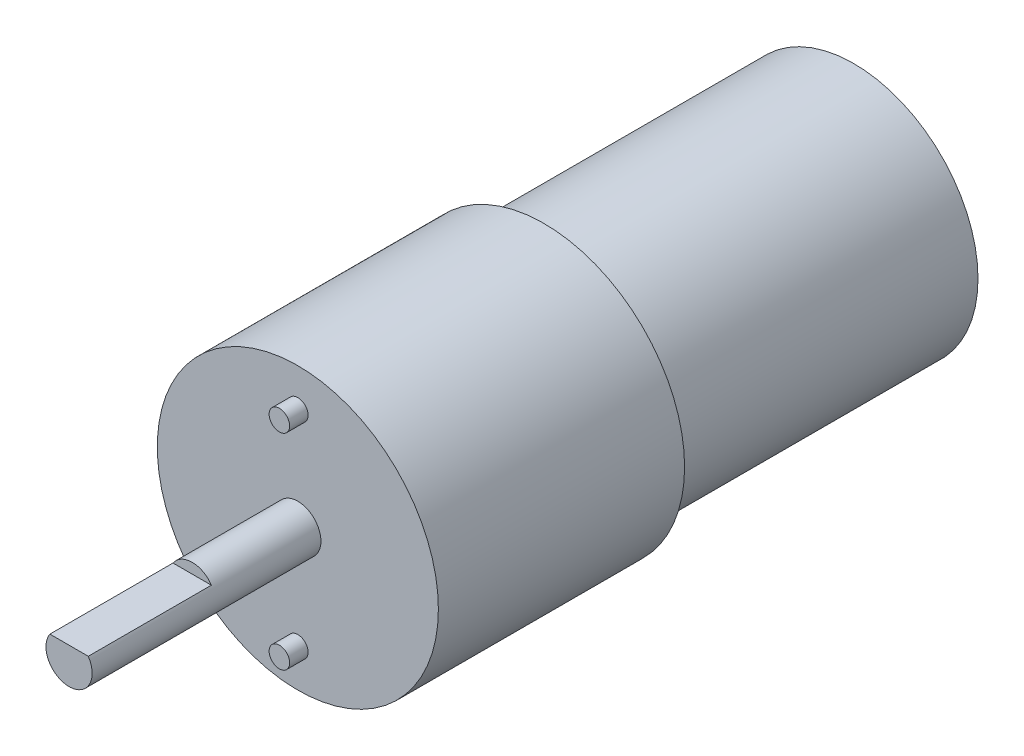
ISO-10303-21;
HEADER;
FILE_DESCRIPTION(('STEP AP214'),'2;1');
FILE_NAME('part.step','',(''),(''),'','','');
FILE_SCHEMA(('AUTOMOTIVE_DESIGN { 1 0 10303 214 1 1 1 1 }'));
ENDSEC;
DATA;
#1=APPLICATION_CONTEXT('core data for automotive mechanical design processes');
#2=APPLICATION_PROTOCOL_DEFINITION('international standard','automotive_design',2000,#1);
#3=PRODUCT_CONTEXT('',#1,'mechanical');
#4=PRODUCT('Part','Part','',(#3));
#5=PRODUCT_RELATED_PRODUCT_CATEGORY('part','',(#4));
#6=PRODUCT_DEFINITION_FORMATION('','',#4);
#7=PRODUCT_DEFINITION_CONTEXT('part definition',#1,'design');
#8=PRODUCT_DEFINITION('design','',#6,#7);
#9=PRODUCT_DEFINITION_SHAPE('','',#8);
#10=(LENGTH_UNIT() NAMED_UNIT(*) SI_UNIT(.MILLI.,.METRE.));
#11=(NAMED_UNIT(*) PLANE_ANGLE_UNIT() SI_UNIT($,.RADIAN.));
#12=(NAMED_UNIT(*) SI_UNIT($,.STERADIAN.) SOLID_ANGLE_UNIT());
#13=UNCERTAINTY_MEASURE_WITH_UNIT(LENGTH_MEASURE(1.E-05),#10,'distance_accuracy_value','');
#14=(GEOMETRIC_REPRESENTATION_CONTEXT(3) GLOBAL_UNCERTAINTY_ASSIGNED_CONTEXT((#13)) GLOBAL_UNIT_ASSIGNED_CONTEXT((#10,
#11,#12)) REPRESENTATION_CONTEXT('',''));
#15=CARTESIAN_POINT('',(0.,0.,0.));
#16=DIRECTION('',(0.,0.,1.));
#17=DIRECTION('',(1.,0.,0.));
#18=AXIS2_PLACEMENT_3D('',#15,#16,#17);
#19=CARTESIAN_POINT('',(0.,0.,54.2));
#20=DIRECTION('',(0.,0.,1.));
#21=DIRECTION('',(1.,0.,0.));
#22=AXIS2_PLACEMENT_3D('',#19,#20,#21);
#23=PLANE('',#22);
#24=CARTESIAN_POINT('',(0.,-10.,54.2));
#25=DIRECTION('',(0.,0.,1.));
#26=DIRECTION('',(1.,0.,0.));
#27=AXIS2_PLACEMENT_3D('',#24,#25,#26);
#28=CIRCLE('',#27,1.);
#29=CARTESIAN_POINT('',(1.,-10.,54.2));
#30=VERTEX_POINT('',#29);
#31=EDGE_CURVE('E77',#30,#30,#28,.T.);
#32=ORIENTED_EDGE('',*,*,#31,.F.);
#33=EDGE_LOOP('',(#32));
#34=FACE_BOUND('',#33,.T.);
#35=CARTESIAN_POINT('',(0.,0.,54.2));
#36=DIRECTION('',(0.,0.,1.));
#37=DIRECTION('',(1.,0.,0.));
#38=AXIS2_PLACEMENT_3D('',#35,#36,#37);
#39=CIRCLE('',#38,13.7);
#40=CARTESIAN_POINT('',(13.7,0.,54.2));
#41=VERTEX_POINT('',#40);
#42=EDGE_CURVE('E92',#41,#41,#39,.T.);
#43=ORIENTED_EDGE('',*,*,#42,.T.);
#44=EDGE_LOOP('',(#43));
#45=FACE_BOUND('',#44,.T.);
#46=CARTESIAN_POINT('',(0.,10.,54.2));
#47=DIRECTION('',(0.,0.,1.));
#48=DIRECTION('',(1.,0.,0.));
#49=AXIS2_PLACEMENT_3D('',#46,#47,#48);
#50=CIRCLE('',#49,1.);
#51=CARTESIAN_POINT('',(1.,10.,54.2));
#52=VERTEX_POINT('',#51);
#53=EDGE_CURVE('E84',#52,#52,#50,.T.);
#54=ORIENTED_EDGE('',*,*,#53,.F.);
#55=EDGE_LOOP('',(#54));
#56=FACE_BOUND('',#55,.T.);
#57=CARTESIAN_POINT('',(0.,0.,54.2));
#58=DIRECTION('',(0.,0.,1.));
#59=DIRECTION('',(1.,0.,0.));
#60=AXIS2_PLACEMENT_3D('',#57,#58,#59);
#61=CIRCLE('',#60,2.25);
#62=CARTESIAN_POINT('',(2.25,0.,54.2));
#63=VERTEX_POINT('',#62);
#64=EDGE_CURVE('E71',#63,#63,#61,.T.);
#65=ORIENTED_EDGE('',*,*,#64,.F.);
#66=EDGE_LOOP('',(#65));
#67=FACE_BOUND('',#66,.T.);
#68=ADVANCED_FACE('F33',(#34,#45,#56,#67),#23,.T.);
#69=CARTESIAN_POINT('',(0.,0.,30.2));
#70=DIRECTION('',(0.,0.,-1.));
#71=DIRECTION('',(-1.,0.,0.));
#72=AXIS2_PLACEMENT_3D('',#69,#70,#71);
#73=CYLINDRICAL_SURFACE('',#72,12.1);
#74=CARTESIAN_POINT('',(0.,0.,30.2));
#75=DIRECTION('',(0.,0.,1.));
#76=DIRECTION('',(1.,0.,0.));
#77=AXIS2_PLACEMENT_3D('',#74,#75,#76);
#78=CIRCLE('',#77,12.1);
#79=CARTESIAN_POINT('',(12.1,0.,30.2));
#80=VERTEX_POINT('',#79);
#81=EDGE_CURVE('E11',#80,#80,#78,.T.);
#82=ORIENTED_EDGE('',*,*,#81,.F.);
#83=EDGE_LOOP('',(#82));
#84=FACE_BOUND('',#83,.T.);
#85=CARTESIAN_POINT('',(0.,0.,0.));
#86=DIRECTION('',(0.,0.,1.));
#87=DIRECTION('',(1.,0.,0.));
#88=AXIS2_PLACEMENT_3D('',#85,#86,#87);
#89=CIRCLE('',#88,12.1);
#90=CARTESIAN_POINT('',(12.1,0.,0.));
#91=VERTEX_POINT('',#90);
#92=EDGE_CURVE('E37',#91,#91,#89,.T.);
#93=ORIENTED_EDGE('',*,*,#92,.T.);
#94=EDGE_LOOP('',(#93));
#95=FACE_BOUND('',#94,.T.);
#96=ADVANCED_FACE('F35',(#84,#95),#73,.T.);
#97=CARTESIAN_POINT('',(0.,0.,0.));
#98=DIRECTION('',(0.,0.,1.));
#99=DIRECTION('',(1.,0.,0.));
#100=AXIS2_PLACEMENT_3D('',#97,#98,#99);
#101=PLANE('',#100);
#102=ORIENTED_EDGE('',*,*,#92,.F.);
#103=EDGE_LOOP('',(#102));
#104=FACE_BOUND('',#103,.T.);
#105=ADVANCED_FACE('F103',(#104),#101,.F.);
#106=CARTESIAN_POINT('',(0.,0.,30.2));
#107=DIRECTION('',(0.,0.,1.));
#108=DIRECTION('',(1.,0.,0.));
#109=AXIS2_PLACEMENT_3D('',#106,#107,#108);
#110=PLANE('',#109);
#111=CARTESIAN_POINT('',(0.,0.,30.2));
#112=DIRECTION('',(0.,0.,1.));
#113=DIRECTION('',(1.,0.,0.));
#114=AXIS2_PLACEMENT_3D('',#111,#112,#113);
#115=CIRCLE('',#114,13.7);
#116=CARTESIAN_POINT('',(13.7,0.,30.2));
#117=VERTEX_POINT('',#116);
#118=EDGE_CURVE('E89',#117,#117,#115,.T.);
#119=ORIENTED_EDGE('',*,*,#118,.F.);
#120=EDGE_LOOP('',(#119));
#121=FACE_BOUND('',#120,.T.);
#122=ORIENTED_EDGE('',*,*,#81,.T.);
#123=EDGE_LOOP('',(#122));
#124=FACE_BOUND('',#123,.T.);
#125=ADVANCED_FACE('F100',(#121,#124),#110,.F.);
#126=CARTESIAN_POINT('',(0.,0.,54.2));
#127=DIRECTION('',(0.,0.,-1.));
#128=DIRECTION('',(-1.,0.,0.));
#129=AXIS2_PLACEMENT_3D('',#126,#127,#128);
#130=CYLINDRICAL_SURFACE('',#129,13.7);
#131=ORIENTED_EDGE('',*,*,#42,.F.);
#132=EDGE_LOOP('',(#131));
#133=FACE_BOUND('',#132,.T.);
#134=ORIENTED_EDGE('',*,*,#118,.T.);
#135=EDGE_LOOP('',(#134));
#136=FACE_BOUND('',#135,.T.);
#137=ADVANCED_FACE('F98',(#133,#136),#130,.T.);
#138=CARTESIAN_POINT('',(0.,10.,56.));
#139=DIRECTION('',(0.,0.,-1.));
#140=DIRECTION('',(-1.,0.,0.));
#141=AXIS2_PLACEMENT_3D('',#138,#139,#140);
#142=CYLINDRICAL_SURFACE('',#141,1.);
#143=CARTESIAN_POINT('',(0.,10.,56.));
#144=DIRECTION('',(0.,0.,1.));
#145=DIRECTION('',(1.,0.,0.));
#146=AXIS2_PLACEMENT_3D('',#143,#144,#145);
#147=CIRCLE('',#146,1.);
#148=CARTESIAN_POINT('',(1.,10.,56.));
#149=VERTEX_POINT('',#148);
#150=EDGE_CURVE('E86',#149,#149,#147,.T.);
#151=ORIENTED_EDGE('',*,*,#150,.F.);
#152=EDGE_LOOP('',(#151));
#153=FACE_BOUND('',#152,.T.);
#154=ORIENTED_EDGE('',*,*,#53,.T.);
#155=EDGE_LOOP('',(#154));
#156=FACE_BOUND('',#155,.T.);
#157=ADVANCED_FACE('F124',(#153,#156),#142,.T.);
#158=CARTESIAN_POINT('',(0.,10.,56.));
#159=DIRECTION('',(0.,0.,1.));
#160=DIRECTION('',(1.,0.,0.));
#161=AXIS2_PLACEMENT_3D('',#158,#159,#160);
#162=PLANE('',#161);
#163=ORIENTED_EDGE('',*,*,#150,.T.);
#164=EDGE_LOOP('',(#163));
#165=FACE_BOUND('',#164,.T.);
#166=ADVANCED_FACE('F131',(#165),#162,.T.);
#167=CARTESIAN_POINT('',(0.,-10.,56.));
#168=DIRECTION('',(0.,0.,-1.));
#169=DIRECTION('',(-1.,0.,0.));
#170=AXIS2_PLACEMENT_3D('',#167,#168,#169);
#171=CYLINDRICAL_SURFACE('',#170,1.);
#172=CARTESIAN_POINT('',(0.,-10.,56.));
#173=DIRECTION('',(0.,0.,1.));
#174=DIRECTION('',(1.,0.,0.));
#175=AXIS2_PLACEMENT_3D('',#172,#173,#174);
#176=CIRCLE('',#175,1.);
#177=CARTESIAN_POINT('',(1.,-10.,56.));
#178=VERTEX_POINT('',#177);
#179=EDGE_CURVE('E74',#178,#178,#176,.T.);
#180=ORIENTED_EDGE('',*,*,#179,.F.);
#181=EDGE_LOOP('',(#180));
#182=FACE_BOUND('',#181,.T.);
#183=ORIENTED_EDGE('',*,*,#31,.T.);
#184=EDGE_LOOP('',(#183));
#185=FACE_BOUND('',#184,.T.);
#186=ADVANCED_FACE('F146',(#182,#185),#171,.T.);
#187=CARTESIAN_POINT('',(0.,-10.,56.));
#188=DIRECTION('',(0.,0.,1.));
#189=DIRECTION('',(1.,0.,0.));
#190=AXIS2_PLACEMENT_3D('',#187,#188,#189);
#191=PLANE('',#190);
#192=ORIENTED_EDGE('',*,*,#179,.T.);
#193=EDGE_LOOP('',(#192));
#194=FACE_BOUND('',#193,.T.);
#195=ADVANCED_FACE('F139',(#194),#191,.T.);
#196=CARTESIAN_POINT('',(0.,0.,76.5));
#197=DIRECTION('',(0.,0.,-1.));
#198=DIRECTION('',(-1.,0.,0.));
#199=AXIS2_PLACEMENT_3D('',#196,#197,#198);
#200=CYLINDRICAL_SURFACE('',#199,2.25);
#201=CARTESIAN_POINT('',(0.,0.,76.5));
#202=DIRECTION('',(0.,0.,1.));
#203=DIRECTION('',(1.,0.,0.));
#204=AXIS2_PLACEMENT_3D('',#201,#202,#203);
#205=CIRCLE('',#204,2.25);
#206=CARTESIAN_POINT('',(-1.87082869338697,1.25,76.5));
#207=VERTEX_POINT('',#206);
#208=CARTESIAN_POINT('',(1.87082869338697,1.25,76.5));
#209=VERTEX_POINT('',#208);
#210=EDGE_CURVE('E70',#207,#209,#205,.T.);
#211=ORIENTED_EDGE('',*,*,#210,.F.);
#212=DIRECTION('',(0.,0.,1.));
#213=VECTOR('',#212,1.);
#214=CARTESIAN_POINT('',(-1.87082869338697,1.25,64.5));
#215=LINE('',#214,#213);
#216=CARTESIAN_POINT('',(-1.87082869338697,1.25,64.5));
#217=VERTEX_POINT('',#216);
#218=EDGE_CURVE('E48',#217,#207,#215,.T.);
#219=ORIENTED_EDGE('',*,*,#218,.F.);
#220=CARTESIAN_POINT('',(0.,0.,64.5));
#221=DIRECTION('',(0.,0.,1.));
#222=DIRECTION('',(1.,0.,0.));
#223=AXIS2_PLACEMENT_3D('',#220,#221,#222);
#224=CIRCLE('',#223,2.25);
#225=CARTESIAN_POINT('',(1.87082869338697,1.25,64.5));
#226=VERTEX_POINT('',#225);
#227=EDGE_CURVE('E64',#226,#217,#224,.T.);
#228=ORIENTED_EDGE('',*,*,#227,.F.);
#229=DIRECTION('',(0.,0.,1.));
#230=VECTOR('',#229,1.);
#231=CARTESIAN_POINT('',(1.87082869338697,1.25,64.5));
#232=LINE('',#231,#230);
#233=EDGE_CURVE('E54',#226,#209,#232,.T.);
#234=ORIENTED_EDGE('',*,*,#233,.T.);
#235=EDGE_LOOP('',(#211,#219,#228,#234));
#236=FACE_BOUND('',#235,.T.);
#237=ORIENTED_EDGE('',*,*,#64,.T.);
#238=EDGE_LOOP('',(#237));
#239=FACE_BOUND('',#238,.T.);
#240=ADVANCED_FACE('F68',(#236,#239),#200,.T.);
#241=CARTESIAN_POINT('',(0.,0.,76.5));
#242=DIRECTION('',(0.,0.,1.));
#243=DIRECTION('',(1.,0.,0.));
#244=AXIS2_PLACEMENT_3D('',#241,#242,#243);
#245=PLANE('',#244);
#246=DIRECTION('',(1.,0.,0.));
#247=VECTOR('',#246,1.);
#248=CARTESIAN_POINT('',(0.,1.25,76.5));
#249=LINE('',#248,#247);
#250=EDGE_CURVE('E59',#207,#209,#249,.T.);
#251=ORIENTED_EDGE('',*,*,#250,.F.);
#252=ORIENTED_EDGE('',*,*,#210,.T.);
#253=EDGE_LOOP('',(#251,#252));
#254=FACE_BOUND('',#253,.T.);
#255=ADVANCED_FACE('F73',(#254),#245,.T.);
#256=CARTESIAN_POINT('',(0.,1.25,64.5));
#257=DIRECTION('',(0.,-1.,0.));
#258=DIRECTION('',(0.,0.,-1.));
#259=AXIS2_PLACEMENT_3D('',#256,#257,#258);
#260=PLANE('',#259);
#261=ORIENTED_EDGE('',*,*,#250,.T.);
#262=ORIENTED_EDGE('',*,*,#233,.F.);
#263=DIRECTION('',(1.,0.,0.));
#264=VECTOR('',#263,1.);
#265=CARTESIAN_POINT('',(0.,1.25,64.5));
#266=LINE('',#265,#264);
#267=EDGE_CURVE('E204',#217,#226,#266,.T.);
#268=ORIENTED_EDGE('',*,*,#267,.F.);
#269=ORIENTED_EDGE('',*,*,#218,.T.);
#270=EDGE_LOOP('',(#261,#262,#268,#269));
#271=FACE_BOUND('',#270,.T.);
#272=ADVANCED_FACE('F60',(#271),#260,.F.);
#273=CARTESIAN_POINT('',(0.,0.,64.5));
#274=DIRECTION('',(0.,0.,1.));
#275=DIRECTION('',(1.,0.,0.));
#276=AXIS2_PLACEMENT_3D('',#273,#274,#275);
#277=PLANE('',#276);
#278=ORIENTED_EDGE('',*,*,#227,.T.);
#279=ORIENTED_EDGE('',*,*,#267,.T.);
#280=EDGE_LOOP('',(#278,#279));
#281=FACE_BOUND('',#280,.T.);
#282=ADVANCED_FACE('F192',(#281),#277,.T.);
#283=CLOSED_SHELL('',(#68,#96,#105,#125,#137,#157,#166,#186,#195,#240,#255,#272,#282));
#284=MANIFOLD_SOLID_BREP('B2',#283);
#285=ADVANCED_BREP_SHAPE_REPRESENTATION('',(#18,#284),#14);
#286=SHAPE_DEFINITION_REPRESENTATION(#9,#285);
ENDSEC;
END-ISO-10303-21;
